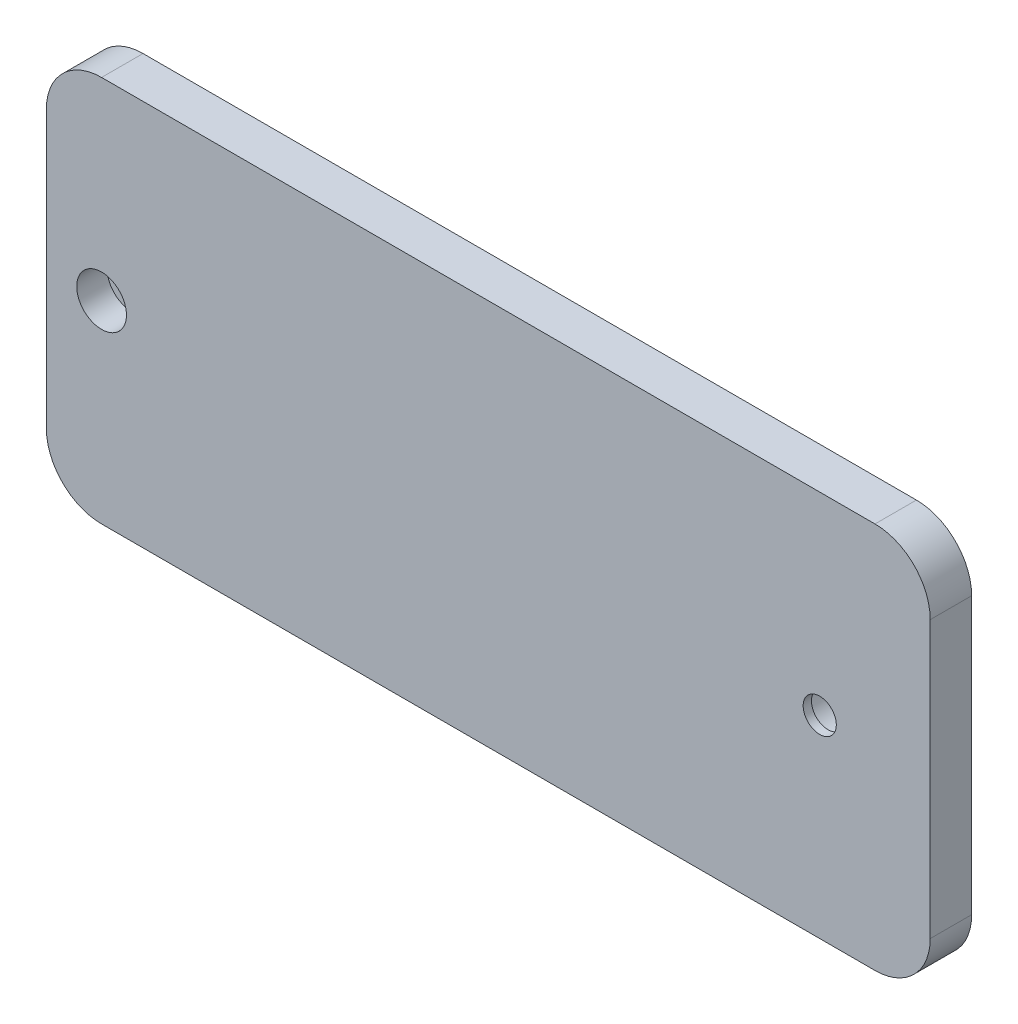
ISO-10303-21;
HEADER;
FILE_DESCRIPTION(('STEP AP214'),'2;1');
FILE_NAME('part.step','',(''),(''),'','','');
FILE_SCHEMA(('AUTOMOTIVE_DESIGN { 1 0 10303 214 1 1 1 1 }'));
ENDSEC;
DATA;
#1=APPLICATION_CONTEXT('core data for automotive mechanical design processes');
#2=APPLICATION_PROTOCOL_DEFINITION('international standard','automotive_design',2000,#1);
#3=PRODUCT_CONTEXT('',#1,'mechanical');
#4=PRODUCT('Part','Part','',(#3));
#5=PRODUCT_RELATED_PRODUCT_CATEGORY('part','',(#4));
#6=PRODUCT_DEFINITION_FORMATION('','',#4);
#7=PRODUCT_DEFINITION_CONTEXT('part definition',#1,'design');
#8=PRODUCT_DEFINITION('design','',#6,#7);
#9=PRODUCT_DEFINITION_SHAPE('','',#8);
#10=(LENGTH_UNIT() NAMED_UNIT(*) SI_UNIT(.MILLI.,.METRE.));
#11=(NAMED_UNIT(*) PLANE_ANGLE_UNIT() SI_UNIT($,.RADIAN.));
#12=(NAMED_UNIT(*) SI_UNIT($,.STERADIAN.) SOLID_ANGLE_UNIT());
#13=UNCERTAINTY_MEASURE_WITH_UNIT(LENGTH_MEASURE(1.E-05),#10,'distance_accuracy_value','');
#14=(GEOMETRIC_REPRESENTATION_CONTEXT(3) GLOBAL_UNCERTAINTY_ASSIGNED_CONTEXT((#13)) GLOBAL_UNIT_ASSIGNED_CONTEXT((#10,
#11,#12)) REPRESENTATION_CONTEXT('',''));
#15=CARTESIAN_POINT('',(0.,0.,0.));
#16=DIRECTION('',(0.,0.,1.));
#17=DIRECTION('',(1.,0.,0.));
#18=AXIS2_PLACEMENT_3D('',#15,#16,#17);
#19=CARTESIAN_POINT('',(0.,0.,0.));
#20=DIRECTION('',(0.,0.,1.));
#21=DIRECTION('',(1.,0.,0.));
#22=AXIS2_PLACEMENT_3D('',#19,#20,#21);
#23=PLANE('',#22);
#24=DIRECTION('',(0.,-1.,0.));
#25=VECTOR('',#24,1.);
#26=CARTESIAN_POINT('',(-80.,35.,0.));
#27=LINE('',#26,#25);
#28=CARTESIAN_POINT('',(-80.,25.,0.));
#29=VERTEX_POINT('',#28);
#30=CARTESIAN_POINT('',(-80.,-25.,0.));
#31=VERTEX_POINT('',#30);
#32=EDGE_CURVE('E311',#29,#31,#27,.T.);
#33=ORIENTED_EDGE('',*,*,#32,.F.);
#34=CARTESIAN_POINT('',(-70.,25.,0.));
#35=DIRECTION('',(0.,0.,1.));
#36=DIRECTION('',(1.,0.,0.));
#37=AXIS2_PLACEMENT_3D('',#34,#35,#36);
#38=CIRCLE('',#37,10.);
#39=CARTESIAN_POINT('',(-70.,35.,0.));
#40=VERTEX_POINT('',#39);
#41=EDGE_CURVE('E414',#29,#40,#38,.F.);
#42=ORIENTED_EDGE('',*,*,#41,.T.);
#43=DIRECTION('',(-1.,0.,0.));
#44=VECTOR('',#43,1.);
#45=CARTESIAN_POINT('',(-80.,35.,0.));
#46=LINE('',#45,#44);
#47=CARTESIAN_POINT('',(70.,35.,0.));
#48=VERTEX_POINT('',#47);
#49=EDGE_CURVE('E317',#48,#40,#46,.T.);
#50=ORIENTED_EDGE('',*,*,#49,.F.);
#51=CARTESIAN_POINT('',(70.,25.,0.));
#52=DIRECTION('',(0.,0.,1.));
#53=DIRECTION('',(1.,0.,0.));
#54=AXIS2_PLACEMENT_3D('',#51,#52,#53);
#55=CIRCLE('',#54,10.);
#56=CARTESIAN_POINT('',(80.,25.,0.));
#57=VERTEX_POINT('',#56);
#58=EDGE_CURVE('E405',#48,#57,#55,.F.);
#59=ORIENTED_EDGE('',*,*,#58,.T.);
#60=DIRECTION('',(0.,1.,0.));
#61=VECTOR('',#60,1.);
#62=CARTESIAN_POINT('',(80.,35.,0.));
#63=LINE('',#62,#61);
#64=CARTESIAN_POINT('',(80.,-25.,0.));
#65=VERTEX_POINT('',#64);
#66=EDGE_CURVE('E335',#65,#57,#63,.T.);
#67=ORIENTED_EDGE('',*,*,#66,.F.);
#68=CARTESIAN_POINT('',(70.,-25.,0.));
#69=DIRECTION('',(0.,0.,1.));
#70=DIRECTION('',(1.,0.,0.));
#71=AXIS2_PLACEMENT_3D('',#68,#69,#70);
#72=CIRCLE('',#71,10.);
#73=CARTESIAN_POINT('',(70.,-35.,0.));
#74=VERTEX_POINT('',#73);
#75=EDGE_CURVE('E408',#65,#74,#72,.F.);
#76=ORIENTED_EDGE('',*,*,#75,.T.);
#77=DIRECTION('',(1.,0.,0.));
#78=VECTOR('',#77,1.);
#79=CARTESIAN_POINT('',(-80.,-35.,0.));
#80=LINE('',#79,#78);
#81=CARTESIAN_POINT('',(-70.,-35.,0.));
#82=VERTEX_POINT('',#81);
#83=EDGE_CURVE('E331',#82,#74,#80,.T.);
#84=ORIENTED_EDGE('',*,*,#83,.F.);
#85=CARTESIAN_POINT('',(-70.,-25.,0.));
#86=DIRECTION('',(0.,0.,1.));
#87=DIRECTION('',(1.,0.,0.));
#88=AXIS2_PLACEMENT_3D('',#85,#86,#87);
#89=CIRCLE('',#88,10.);
#90=EDGE_CURVE('E411',#82,#31,#89,.F.);
#91=ORIENTED_EDGE('',*,*,#90,.T.);
#92=EDGE_LOOP('',(#33,#42,#50,#59,#67,#76,#84,#91));
#93=FACE_BOUND('',#92,.T.);
#94=CARTESIAN_POINT('',(-70.,0.,0.));
#95=DIRECTION('',(0.,0.,1.));
#96=DIRECTION('',(1.,0.,0.));
#97=AXIS2_PLACEMENT_3D('',#94,#95,#96);
#98=CIRCLE('',#97,2.5);
#99=CARTESIAN_POINT('',(-67.5,0.,0.));
#100=VERTEX_POINT('',#99);
#101=EDGE_CURVE('E303',#100,#100,#98,.T.);
#102=ORIENTED_EDGE('',*,*,#101,.T.);
#103=EDGE_LOOP('',(#102));
#104=FACE_BOUND('',#103,.T.);
#105=CARTESIAN_POINT('',(60.,0.,0.));
#106=DIRECTION('',(0.,0.,-1.));
#107=DIRECTION('',(-1.,0.,0.));
#108=AXIS2_PLACEMENT_3D('',#105,#106,#107);
#109=CIRCLE('',#108,5.);
#110=CARTESIAN_POINT('',(55.,0.,0.));
#111=VERTEX_POINT('',#110);
#112=EDGE_CURVE('E285',#111,#111,#109,.T.);
#113=ORIENTED_EDGE('',*,*,#112,.F.);
#114=EDGE_LOOP('',(#113));
#115=FACE_BOUND('',#114,.T.);
#116=DIRECTION('',(0.,-1.,0.));
#117=VECTOR('',#116,1.);
#118=CARTESIAN_POINT('',(35.,2.5,0.));
#119=LINE('',#118,#117);
#120=CARTESIAN_POINT('',(35.,2.5,0.));
#121=VERTEX_POINT('',#120);
#122=CARTESIAN_POINT('',(35.,-2.5,0.));
#123=VERTEX_POINT('',#122);
#124=EDGE_CURVE('E263',#121,#123,#119,.T.);
#125=ORIENTED_EDGE('',*,*,#124,.F.);
#126=DIRECTION('',(1.,0.,0.));
#127=VECTOR('',#126,1.);
#128=CARTESIAN_POINT('',(35.,2.5,0.));
#129=LINE('',#128,#127);
#130=CARTESIAN_POINT('',(-60.,2.5,0.));
#131=VERTEX_POINT('',#130);
#132=EDGE_CURVE('E246',#131,#121,#129,.T.);
#133=ORIENTED_EDGE('',*,*,#132,.F.);
#134=DIRECTION('',(0.,1.,0.));
#135=VECTOR('',#134,1.);
#136=CARTESIAN_POINT('',(-60.,2.5,0.));
#137=LINE('',#136,#135);
#138=CARTESIAN_POINT('',(-60.,-2.5,0.));
#139=VERTEX_POINT('',#138);
#140=EDGE_CURVE('E270',#139,#131,#137,.T.);
#141=ORIENTED_EDGE('',*,*,#140,.F.);
#142=DIRECTION('',(-1.,0.,0.));
#143=VECTOR('',#142,1.);
#144=CARTESIAN_POINT('',(35.,-2.5,0.));
#145=LINE('',#144,#143);
#146=EDGE_CURVE('E266',#123,#139,#145,.T.);
#147=ORIENTED_EDGE('',*,*,#146,.F.);
#148=EDGE_LOOP('',(#125,#133,#141,#147));
#149=FACE_BOUND('',#148,.T.);
#150=ADVANCED_FACE('F46',(#93,#104,#115,#149),#23,.F.);
#151=CARTESIAN_POINT('',(60.,0.,0.));
#152=DIRECTION('',(0.,0.,1.));
#153=DIRECTION('',(1.,0.,0.));
#154=AXIS2_PLACEMENT_3D('',#151,#152,#153);
#155=CYLINDRICAL_SURFACE('',#154,3.00000000000001);
#156=CARTESIAN_POINT('',(60.,0.,7.5));
#157=DIRECTION('',(0.,0.,1.));
#158=DIRECTION('',(1.,0.,0.));
#159=AXIS2_PLACEMENT_3D('',#156,#157,#158);
#160=CIRCLE('',#159,3.00000000000001);
#161=CARTESIAN_POINT('',(63.,0.,7.5));
#162=VERTEX_POINT('',#161);
#163=EDGE_CURVE('E307',#162,#162,#160,.T.);
#164=ORIENTED_EDGE('',*,*,#163,.T.);
#165=EDGE_LOOP('',(#164));
#166=FACE_BOUND('',#165,.T.);
#167=CARTESIAN_POINT('',(60.,0.,6.));
#168=DIRECTION('',(0.,0.,-1.));
#169=DIRECTION('',(-1.,0.,0.));
#170=AXIS2_PLACEMENT_3D('',#167,#168,#169);
#171=CIRCLE('',#170,3.00000000000001);
#172=CARTESIAN_POINT('',(57.,0.,6.));
#173=VERTEX_POINT('',#172);
#174=EDGE_CURVE('E290',#173,#173,#171,.F.);
#175=ORIENTED_EDGE('',*,*,#174,.F.);
#176=EDGE_LOOP('',(#175));
#177=FACE_BOUND('',#176,.T.);
#178=ADVANCED_FACE('F519',(#166,#177),#155,.F.);
#179=CARTESIAN_POINT('',(-70.,0.,0.));
#180=DIRECTION('',(0.,0.,1.));
#181=DIRECTION('',(1.,0.,0.));
#182=AXIS2_PLACEMENT_3D('',#179,#180,#181);
#183=CYLINDRICAL_SURFACE('',#182,2.5);
#184=ORIENTED_EDGE('',*,*,#101,.F.);
#185=EDGE_LOOP('',(#184));
#186=FACE_BOUND('',#185,.T.);
#187=CARTESIAN_POINT('',(-70.,0.,2.));
#188=DIRECTION('',(0.,0.,1.));
#189=DIRECTION('',(1.,0.,0.));
#190=AXIS2_PLACEMENT_3D('',#187,#188,#189);
#191=CIRCLE('',#190,2.5);
#192=CARTESIAN_POINT('',(-67.5,0.,2.));
#193=VERTEX_POINT('',#192);
#194=EDGE_CURVE('E298',#193,#193,#191,.F.);
#195=ORIENTED_EDGE('',*,*,#194,.F.);
#196=EDGE_LOOP('',(#195));
#197=FACE_BOUND('',#196,.T.);
#198=ADVANCED_FACE('F525',(#186,#197),#183,.F.);
#199=CARTESIAN_POINT('',(-80.,35.,7.5));
#200=DIRECTION('',(1.,0.,0.));
#201=DIRECTION('',(0.,0.,-1.));
#202=AXIS2_PLACEMENT_3D('',#199,#200,#201);
#203=PLANE('',#202);
#204=DIRECTION('',(0.,-1.,0.));
#205=VECTOR('',#204,1.);
#206=CARTESIAN_POINT('',(-80.,35.,7.5));
#207=LINE('',#206,#205);
#208=CARTESIAN_POINT('',(-80.,25.,7.5));
#209=VERTEX_POINT('',#208);
#210=CARTESIAN_POINT('',(-80.,-25.,7.5));
#211=VERTEX_POINT('',#210);
#212=EDGE_CURVE('E312',#209,#211,#207,.T.);
#213=ORIENTED_EDGE('',*,*,#212,.F.);
#214=DIRECTION('',(0.,0.,-1.));
#215=VECTOR('',#214,1.);
#216=CARTESIAN_POINT('',(-80.,25.,7.5));
#217=LINE('',#216,#215);
#218=EDGE_CURVE('E401',#209,#29,#217,.T.);
#219=ORIENTED_EDGE('',*,*,#218,.T.);
#220=ORIENTED_EDGE('',*,*,#32,.T.);
#221=DIRECTION('',(0.,0.,-1.));
#222=VECTOR('',#221,1.);
#223=CARTESIAN_POINT('',(-80.,-25.,7.5));
#224=LINE('',#223,#222);
#225=EDGE_CURVE('E398',#31,#211,#224,.F.);
#226=ORIENTED_EDGE('',*,*,#225,.T.);
#227=EDGE_LOOP('',(#213,#219,#220,#226));
#228=FACE_BOUND('',#227,.T.);
#229=ADVANCED_FACE('F543',(#228),#203,.F.);
#230=CARTESIAN_POINT('',(-80.,-35.,7.5));
#231=DIRECTION('',(0.,1.,0.));
#232=DIRECTION('',(-1.,0.,0.));
#233=AXIS2_PLACEMENT_3D('',#230,#231,#232);
#234=PLANE('',#233);
#235=DIRECTION('',(1.,0.,0.));
#236=VECTOR('',#235,1.);
#237=CARTESIAN_POINT('',(-80.,-35.,7.5));
#238=LINE('',#237,#236);
#239=CARTESIAN_POINT('',(-70.,-35.,7.5));
#240=VERTEX_POINT('',#239);
#241=CARTESIAN_POINT('',(70.,-35.,7.5));
#242=VERTEX_POINT('',#241);
#243=EDGE_CURVE('E316',#240,#242,#238,.T.);
#244=ORIENTED_EDGE('',*,*,#243,.F.);
#245=DIRECTION('',(0.,0.,-1.));
#246=VECTOR('',#245,1.);
#247=CARTESIAN_POINT('',(-70.,-35.,7.5));
#248=LINE('',#247,#246);
#249=EDGE_CURVE('E438',#240,#82,#248,.T.);
#250=ORIENTED_EDGE('',*,*,#249,.T.);
#251=ORIENTED_EDGE('',*,*,#83,.T.);
#252=DIRECTION('',(0.,0.,-1.));
#253=VECTOR('',#252,1.);
#254=CARTESIAN_POINT('',(70.,-35.,7.5));
#255=LINE('',#254,#253);
#256=EDGE_CURVE('E435',#74,#242,#255,.F.);
#257=ORIENTED_EDGE('',*,*,#256,.T.);
#258=EDGE_LOOP('',(#244,#250,#251,#257));
#259=FACE_BOUND('',#258,.T.);
#260=ADVANCED_FACE('F540',(#259),#234,.F.);
#261=CARTESIAN_POINT('',(80.,35.,7.5));
#262=DIRECTION('',(-1.,0.,0.));
#263=DIRECTION('',(0.,0.,1.));
#264=AXIS2_PLACEMENT_3D('',#261,#262,#263);
#265=PLANE('',#264);
#266=DIRECTION('',(0.,1.,0.));
#267=VECTOR('',#266,1.);
#268=CARTESIAN_POINT('',(80.,35.,7.5));
#269=LINE('',#268,#267);
#270=CARTESIAN_POINT('',(80.,-25.,7.5));
#271=VERTEX_POINT('',#270);
#272=CARTESIAN_POINT('',(80.,25.,7.5));
#273=VERTEX_POINT('',#272);
#274=EDGE_CURVE('E320',#271,#273,#269,.T.);
#275=ORIENTED_EDGE('',*,*,#274,.F.);
#276=DIRECTION('',(0.,0.,-1.));
#277=VECTOR('',#276,1.);
#278=CARTESIAN_POINT('',(80.,-25.,7.5));
#279=LINE('',#278,#277);
#280=EDGE_CURVE('E11',#271,#65,#279,.T.);
#281=ORIENTED_EDGE('',*,*,#280,.T.);
#282=ORIENTED_EDGE('',*,*,#66,.T.);
#283=DIRECTION('',(0.,0.,-1.));
#284=VECTOR('',#283,1.);
#285=CARTESIAN_POINT('',(80.,25.,7.5));
#286=LINE('',#285,#284);
#287=EDGE_CURVE('E55',#57,#273,#286,.F.);
#288=ORIENTED_EDGE('',*,*,#287,.T.);
#289=EDGE_LOOP('',(#275,#281,#282,#288));
#290=FACE_BOUND('',#289,.T.);
#291=ADVANCED_FACE('F536',(#290),#265,.F.);
#292=CARTESIAN_POINT('',(-80.,35.,7.5));
#293=DIRECTION('',(0.,-1.,0.));
#294=DIRECTION('',(0.,0.,-1.));
#295=AXIS2_PLACEMENT_3D('',#292,#293,#294);
#296=PLANE('',#295);
#297=ORIENTED_EDGE('',*,*,#49,.T.);
#298=DIRECTION('',(0.,0.,-1.));
#299=VECTOR('',#298,1.);
#300=CARTESIAN_POINT('',(-70.,35.,7.5));
#301=LINE('',#300,#299);
#302=CARTESIAN_POINT('',(-70.,35.,7.5));
#303=VERTEX_POINT('',#302);
#304=EDGE_CURVE('E421',#40,#303,#301,.F.);
#305=ORIENTED_EDGE('',*,*,#304,.T.);
#306=DIRECTION('',(-1.,0.,0.));
#307=VECTOR('',#306,1.);
#308=CARTESIAN_POINT('',(-80.,35.,7.5));
#309=LINE('',#308,#307);
#310=CARTESIAN_POINT('',(70.,35.,7.5));
#311=VERTEX_POINT('',#310);
#312=EDGE_CURVE('E323',#311,#303,#309,.T.);
#313=ORIENTED_EDGE('',*,*,#312,.F.);
#314=DIRECTION('',(0.,0.,-1.));
#315=VECTOR('',#314,1.);
#316=CARTESIAN_POINT('',(70.,35.,7.5));
#317=LINE('',#316,#315);
#318=EDGE_CURVE('E417',#311,#48,#317,.T.);
#319=ORIENTED_EDGE('',*,*,#318,.T.);
#320=EDGE_LOOP('',(#297,#305,#313,#319));
#321=FACE_BOUND('',#320,.T.);
#322=ADVANCED_FACE('F533',(#321),#296,.F.);
#323=CARTESIAN_POINT('',(0.,0.,7.5));
#324=DIRECTION('',(0.,0.,1.));
#325=DIRECTION('',(1.,0.,0.));
#326=AXIS2_PLACEMENT_3D('',#323,#324,#325);
#327=PLANE('',#326);
#328=CARTESIAN_POINT('',(-70.,0.,7.5));
#329=DIRECTION('',(0.,0.,1.));
#330=DIRECTION('',(1.,0.,0.));
#331=AXIS2_PLACEMENT_3D('',#328,#329,#330);
#332=CIRCLE('',#331,4.5);
#333=CARTESIAN_POINT('',(-65.5,0.,7.5));
#334=VERTEX_POINT('',#333);
#335=EDGE_CURVE('E299',#334,#334,#332,.T.);
#336=ORIENTED_EDGE('',*,*,#335,.F.);
#337=EDGE_LOOP('',(#336));
#338=FACE_BOUND('',#337,.T.);
#339=ORIENTED_EDGE('',*,*,#163,.F.);
#340=EDGE_LOOP('',(#339));
#341=FACE_BOUND('',#340,.T.);
#342=ORIENTED_EDGE('',*,*,#312,.T.);
#343=CARTESIAN_POINT('',(-70.,25.,7.5));
#344=DIRECTION('',(0.,0.,1.));
#345=DIRECTION('',(1.,0.,0.));
#346=AXIS2_PLACEMENT_3D('',#343,#344,#345);
#347=CIRCLE('',#346,10.);
#348=EDGE_CURVE('E432',#303,#209,#347,.T.);
#349=ORIENTED_EDGE('',*,*,#348,.T.);
#350=ORIENTED_EDGE('',*,*,#212,.T.);
#351=CARTESIAN_POINT('',(-70.,-25.,7.5));
#352=DIRECTION('',(0.,0.,1.));
#353=DIRECTION('',(1.,0.,0.));
#354=AXIS2_PLACEMENT_3D('',#351,#352,#353);
#355=CIRCLE('',#354,10.);
#356=EDGE_CURVE('E429',#211,#240,#355,.T.);
#357=ORIENTED_EDGE('',*,*,#356,.T.);
#358=ORIENTED_EDGE('',*,*,#243,.T.);
#359=CARTESIAN_POINT('',(70.,-25.,7.5));
#360=DIRECTION('',(0.,0.,1.));
#361=DIRECTION('',(1.,0.,0.));
#362=AXIS2_PLACEMENT_3D('',#359,#360,#361);
#363=CIRCLE('',#362,10.);
#364=EDGE_CURVE('E74',#242,#271,#363,.T.);
#365=ORIENTED_EDGE('',*,*,#364,.T.);
#366=ORIENTED_EDGE('',*,*,#274,.T.);
#367=CARTESIAN_POINT('',(70.,25.,7.5));
#368=DIRECTION('',(0.,0.,1.));
#369=DIRECTION('',(1.,0.,0.));
#370=AXIS2_PLACEMENT_3D('',#367,#368,#369);
#371=CIRCLE('',#370,10.);
#372=EDGE_CURVE('E424',#273,#311,#371,.T.);
#373=ORIENTED_EDGE('',*,*,#372,.T.);
#374=EDGE_LOOP('',(#342,#349,#350,#357,#358,#365,#366,#373));
#375=FACE_BOUND('',#374,.T.);
#376=ADVANCED_FACE('F532',(#338,#341,#375),#327,.T.);
#377=CARTESIAN_POINT('',(-70.,0.,2.));
#378=DIRECTION('',(0.,0.,1.));
#379=DIRECTION('',(1.,0.,0.));
#380=AXIS2_PLACEMENT_3D('',#377,#378,#379);
#381=PLANE('',#380);
#382=CARTESIAN_POINT('',(-70.,0.,2.));
#383=DIRECTION('',(0.,0.,1.));
#384=DIRECTION('',(1.,0.,0.));
#385=AXIS2_PLACEMENT_3D('',#382,#383,#384);
#386=CIRCLE('',#385,4.5);
#387=CARTESIAN_POINT('',(-65.5,0.,2.));
#388=VERTEX_POINT('',#387);
#389=EDGE_CURVE('E294',#388,#388,#386,.T.);
#390=ORIENTED_EDGE('',*,*,#389,.T.);
#391=EDGE_LOOP('',(#390));
#392=FACE_BOUND('',#391,.T.);
#393=ORIENTED_EDGE('',*,*,#194,.T.);
#394=EDGE_LOOP('',(#393));
#395=FACE_BOUND('',#394,.T.);
#396=ADVANCED_FACE('F587',(#392,#395),#381,.T.);
#397=CARTESIAN_POINT('',(-70.,0.,2.));
#398=DIRECTION('',(0.,0.,1.));
#399=DIRECTION('',(1.,0.,0.));
#400=AXIS2_PLACEMENT_3D('',#397,#398,#399);
#401=CYLINDRICAL_SURFACE('',#400,4.5);
#402=ORIENTED_EDGE('',*,*,#389,.F.);
#403=EDGE_LOOP('',(#402));
#404=FACE_BOUND('',#403,.T.);
#405=ORIENTED_EDGE('',*,*,#335,.T.);
#406=EDGE_LOOP('',(#405));
#407=FACE_BOUND('',#406,.T.);
#408=ADVANCED_FACE('F592',(#404,#407),#401,.F.);
#409=CARTESIAN_POINT('',(60.,0.,6.));
#410=DIRECTION('',(0.,0.,-1.));
#411=DIRECTION('',(-1.,0.,0.));
#412=AXIS2_PLACEMENT_3D('',#409,#410,#411);
#413=PLANE('',#412);
#414=CARTESIAN_POINT('',(60.,0.,6.));
#415=DIRECTION('',(0.,0.,-1.));
#416=DIRECTION('',(-1.,0.,0.));
#417=AXIS2_PLACEMENT_3D('',#414,#415,#416);
#418=CIRCLE('',#417,5.);
#419=CARTESIAN_POINT('',(55.,0.,6.));
#420=VERTEX_POINT('',#419);
#421=EDGE_CURVE('E286',#420,#420,#418,.T.);
#422=ORIENTED_EDGE('',*,*,#421,.T.);
#423=EDGE_LOOP('',(#422));
#424=FACE_BOUND('',#423,.T.);
#425=ORIENTED_EDGE('',*,*,#174,.T.);
#426=EDGE_LOOP('',(#425));
#427=FACE_BOUND('',#426,.T.);
#428=ADVANCED_FACE('F601',(#424,#427),#413,.T.);
#429=CARTESIAN_POINT('',(60.,0.,6.));
#430=DIRECTION('',(0.,0.,-1.));
#431=DIRECTION('',(-1.,0.,0.));
#432=AXIS2_PLACEMENT_3D('',#429,#430,#431);
#433=CYLINDRICAL_SURFACE('',#432,5.);
#434=ORIENTED_EDGE('',*,*,#421,.F.);
#435=EDGE_LOOP('',(#434));
#436=FACE_BOUND('',#435,.T.);
#437=ORIENTED_EDGE('',*,*,#112,.T.);
#438=EDGE_LOOP('',(#437));
#439=FACE_BOUND('',#438,.T.);
#440=ADVANCED_FACE('F516',(#436,#439),#433,.F.);
#441=CARTESIAN_POINT('',(35.,2.5,-2.3));
#442=DIRECTION('',(-1.,0.,0.));
#443=DIRECTION('',(0.,0.,1.));
#444=AXIS2_PLACEMENT_3D('',#441,#442,#443);
#445=PLANE('',#444);
#446=DIRECTION('',(0.,-1.,0.));
#447=VECTOR('',#446,1.);
#448=CARTESIAN_POINT('',(35.,6.,-2.3));
#449=LINE('',#448,#447);
#450=CARTESIAN_POINT('',(35.,-2.5,-2.3));
#451=VERTEX_POINT('',#450);
#452=CARTESIAN_POINT('',(35.,-4.94832947555214,-2.3));
#453=VERTEX_POINT('',#452);
#454=EDGE_CURVE('E238',#451,#453,#449,.T.);
#455=ORIENTED_EDGE('',*,*,#454,.T.);
#456=CARTESIAN_POINT('',(35.,-4.94832947555214,-2.8));
#457=DIRECTION('',(-1.,0.,0.));
#458=DIRECTION('',(0.,0.,1.));
#459=AXIS2_PLACEMENT_3D('',#456,#457,#458);
#460=CIRCLE('',#459,0.5);
#461=CARTESIAN_POINT('',(35.,-5.33611047740773,-3.11563569918479));
#462=VERTEX_POINT('',#461);
#463=EDGE_CURVE('E379',#453,#462,#460,.F.);
#464=ORIENTED_EDGE('',*,*,#463,.T.);
#465=DIRECTION('',(0.,0.631271398369576,-0.775562003711193));
#466=VECTOR('',#465,1.);
#467=CARTESIAN_POINT('',(35.,-2.5,-6.6));
#468=LINE('',#467,#466);
#469=CARTESIAN_POINT('',(35.,-2.80012793155965,-6.23127139836958));
#470=VERTEX_POINT('',#469);
#471=EDGE_CURVE('E460',#462,#470,#468,.T.);
#472=ORIENTED_EDGE('',*,*,#471,.T.);
#473=CARTESIAN_POINT('',(35.,-2.02456592784845,-5.6));
#474=DIRECTION('',(-1.,0.,0.));
#475=DIRECTION('',(0.,0.,1.));
#476=AXIS2_PLACEMENT_3D('',#473,#474,#475);
#477=CIRCLE('',#476,1.);
#478=CARTESIAN_POINT('',(35.,-2.02456592784845,-6.6));
#479=VERTEX_POINT('',#478);
#480=EDGE_CURVE('E353',#470,#479,#477,.F.);
#481=ORIENTED_EDGE('',*,*,#480,.T.);
#482=DIRECTION('',(0.,1.,0.));
#483=VECTOR('',#482,1.);
#484=CARTESIAN_POINT('',(35.,2.5,-6.6));
#485=LINE('',#484,#483);
#486=CARTESIAN_POINT('',(35.,2.02456592784845,-6.6));
#487=VERTEX_POINT('',#486);
#488=EDGE_CURVE('E463',#479,#487,#485,.T.);
#489=ORIENTED_EDGE('',*,*,#488,.T.);
#490=CARTESIAN_POINT('',(35.,2.02456592784845,-5.6));
#491=DIRECTION('',(-1.,0.,0.));
#492=DIRECTION('',(0.,0.,1.));
#493=AXIS2_PLACEMENT_3D('',#490,#491,#492);
#494=CIRCLE('',#493,1.);
#495=CARTESIAN_POINT('',(35.,2.80012793155965,-6.23127139836958));
#496=VERTEX_POINT('',#495);
#497=EDGE_CURVE('E350',#487,#496,#494,.F.);
#498=ORIENTED_EDGE('',*,*,#497,.T.);
#499=DIRECTION('',(0.,0.631271398369576,0.775562003711193));
#500=VECTOR('',#499,1.);
#501=CARTESIAN_POINT('',(35.,6.,-2.3));
#502=LINE('',#501,#500);
#503=CARTESIAN_POINT('',(35.,5.33611047740773,-3.11563569918479));
#504=VERTEX_POINT('',#503);
#505=EDGE_CURVE('E467',#496,#504,#502,.T.);
#506=ORIENTED_EDGE('',*,*,#505,.T.);
#507=CARTESIAN_POINT('',(35.,4.94832947555213,-2.8));
#508=DIRECTION('',(-1.,0.,0.));
#509=DIRECTION('',(0.,0.,1.));
#510=AXIS2_PLACEMENT_3D('',#507,#508,#509);
#511=CIRCLE('',#510,0.5);
#512=CARTESIAN_POINT('',(35.,4.94832947555213,-2.3));
#513=VERTEX_POINT('',#512);
#514=EDGE_CURVE('E232',#504,#513,#511,.F.);
#515=ORIENTED_EDGE('',*,*,#514,.T.);
#516=CARTESIAN_POINT('',(35.,2.5,-2.3));
#517=VERTEX_POINT('',#516);
#518=EDGE_CURVE('E225',#513,#517,#449,.T.);
#519=ORIENTED_EDGE('',*,*,#518,.T.);
#520=DIRECTION('',(0.,0.,1.));
#521=VECTOR('',#520,1.);
#522=CARTESIAN_POINT('',(35.,2.5,-2.3));
#523=LINE('',#522,#521);
#524=EDGE_CURVE('E230',#517,#121,#523,.T.);
#525=ORIENTED_EDGE('',*,*,#524,.T.);
#526=ORIENTED_EDGE('',*,*,#124,.T.);
#527=DIRECTION('',(0.,0.,1.));
#528=VECTOR('',#527,1.);
#529=CARTESIAN_POINT('',(35.,-2.5,-2.3));
#530=LINE('',#529,#528);
#531=EDGE_CURVE('E281',#451,#123,#530,.T.);
#532=ORIENTED_EDGE('',*,*,#531,.F.);
#533=EDGE_LOOP('',(#455,#464,#472,#481,#489,#498,#506,#515,#519,#525,#526,#532));
#534=FACE_BOUND('',#533,.T.);
#535=ADVANCED_FACE('F228',(#534),#445,.F.);
#536=CARTESIAN_POINT('',(35.,-2.5,-2.3));
#537=DIRECTION('',(0.,1.,0.));
#538=DIRECTION('',(0.,0.,1.));
#539=AXIS2_PLACEMENT_3D('',#536,#537,#538);
#540=PLANE('',#539);
#541=ORIENTED_EDGE('',*,*,#146,.T.);
#542=DIRECTION('',(0.,0.,1.));
#543=VECTOR('',#542,1.);
#544=CARTESIAN_POINT('',(-60.,-2.5,-2.3));
#545=LINE('',#544,#543);
#546=CARTESIAN_POINT('',(-60.,-2.5,-2.3));
#547=VERTEX_POINT('',#546);
#548=EDGE_CURVE('E277',#547,#139,#545,.T.);
#549=ORIENTED_EDGE('',*,*,#548,.F.);
#550=DIRECTION('',(-1.,0.,0.));
#551=VECTOR('',#550,1.);
#552=CARTESIAN_POINT('',(35.,-2.5,-2.3));
#553=LINE('',#552,#551);
#554=EDGE_CURVE('E255',#451,#547,#553,.T.);
#555=ORIENTED_EDGE('',*,*,#554,.F.);
#556=ORIENTED_EDGE('',*,*,#531,.T.);
#557=EDGE_LOOP('',(#541,#549,#555,#556));
#558=FACE_BOUND('',#557,.T.);
#559=ADVANCED_FACE('F508',(#558),#540,.F.);
#560=CARTESIAN_POINT('',(-60.,2.5,-2.3));
#561=DIRECTION('',(1.,0.,0.));
#562=DIRECTION('',(0.,0.,-1.));
#563=AXIS2_PLACEMENT_3D('',#560,#561,#562);
#564=PLANE('',#563);
#565=DIRECTION('',(0.,0.631271398369576,-0.775562003711193));
#566=VECTOR('',#565,1.);
#567=CARTESIAN_POINT('',(-60.,-2.5,-6.6));
#568=LINE('',#567,#566);
#569=CARTESIAN_POINT('',(-60.,-5.33611047740773,-3.11563569918479));
#570=VERTEX_POINT('',#569);
#571=CARTESIAN_POINT('',(-60.,-2.80012793155965,-6.23127139836958));
#572=VERTEX_POINT('',#571);
#573=EDGE_CURVE('E237',#570,#572,#568,.T.);
#574=ORIENTED_EDGE('',*,*,#573,.F.);
#575=CARTESIAN_POINT('',(-60.,-4.94832947555214,-2.8));
#576=DIRECTION('',(1.,0.,0.));
#577=DIRECTION('',(0.,0.,-1.));
#578=AXIS2_PLACEMENT_3D('',#575,#576,#577);
#579=CIRCLE('',#578,0.5);
#580=CARTESIAN_POINT('',(-60.,-4.94832947555214,-2.3));
#581=VERTEX_POINT('',#580);
#582=EDGE_CURVE('E388',#570,#581,#579,.F.);
#583=ORIENTED_EDGE('',*,*,#582,.T.);
#584=DIRECTION('',(0.,-1.,0.));
#585=VECTOR('',#584,1.);
#586=CARTESIAN_POINT('',(-60.,6.,-2.3));
#587=LINE('',#586,#585);
#588=EDGE_CURVE('E442',#547,#581,#587,.T.);
#589=ORIENTED_EDGE('',*,*,#588,.F.);
#590=ORIENTED_EDGE('',*,*,#548,.T.);
#591=ORIENTED_EDGE('',*,*,#140,.T.);
#592=DIRECTION('',(0.,0.,1.));
#593=VECTOR('',#592,1.);
#594=CARTESIAN_POINT('',(-60.,2.5,-2.3));
#595=LINE('',#594,#593);
#596=CARTESIAN_POINT('',(-60.,2.5,-2.3));
#597=VERTEX_POINT('',#596);
#598=EDGE_CURVE('E248',#597,#131,#595,.T.);
#599=ORIENTED_EDGE('',*,*,#598,.F.);
#600=CARTESIAN_POINT('',(-60.,4.94832947555213,-2.3));
#601=VERTEX_POINT('',#600);
#602=EDGE_CURVE('E252',#601,#597,#587,.T.);
#603=ORIENTED_EDGE('',*,*,#602,.F.);
#604=CARTESIAN_POINT('',(-60.,4.94832947555213,-2.8));
#605=DIRECTION('',(1.,0.,0.));
#606=DIRECTION('',(0.,0.,-1.));
#607=AXIS2_PLACEMENT_3D('',#604,#605,#606);
#608=CIRCLE('',#607,0.5);
#609=CARTESIAN_POINT('',(-60.,5.33611047740773,-3.11563569918479));
#610=VERTEX_POINT('',#609);
#611=EDGE_CURVE('E385',#601,#610,#608,.F.);
#612=ORIENTED_EDGE('',*,*,#611,.T.);
#613=DIRECTION('',(0.,0.631271398369576,0.775562003711193));
#614=VECTOR('',#613,1.);
#615=CARTESIAN_POINT('',(-60.,6.,-2.3));
#616=LINE('',#615,#614);
#617=CARTESIAN_POINT('',(-60.,2.80012793155965,-6.23127139836958));
#618=VERTEX_POINT('',#617);
#619=EDGE_CURVE('E444',#618,#610,#616,.T.);
#620=ORIENTED_EDGE('',*,*,#619,.F.);
#621=CARTESIAN_POINT('',(-60.,2.02456592784845,-5.6));
#622=DIRECTION('',(1.,0.,0.));
#623=DIRECTION('',(0.,0.,-1.));
#624=AXIS2_PLACEMENT_3D('',#621,#622,#623);
#625=CIRCLE('',#624,1.);
#626=CARTESIAN_POINT('',(-60.,2.02456592784845,-6.6));
#627=VERTEX_POINT('',#626);
#628=EDGE_CURVE('E363',#618,#627,#625,.F.);
#629=ORIENTED_EDGE('',*,*,#628,.T.);
#630=DIRECTION('',(0.,1.,0.));
#631=VECTOR('',#630,1.);
#632=CARTESIAN_POINT('',(-60.,2.5,-6.6));
#633=LINE('',#632,#631);
#634=CARTESIAN_POINT('',(-60.,-2.02456592784845,-6.6));
#635=VERTEX_POINT('',#634);
#636=EDGE_CURVE('E447',#635,#627,#633,.T.);
#637=ORIENTED_EDGE('',*,*,#636,.F.);
#638=CARTESIAN_POINT('',(-60.,-2.02456592784845,-5.6));
#639=DIRECTION('',(1.,0.,0.));
#640=DIRECTION('',(0.,0.,-1.));
#641=AXIS2_PLACEMENT_3D('',#638,#639,#640);
#642=CIRCLE('',#641,1.);
#643=EDGE_CURVE('E366',#635,#572,#642,.F.);
#644=ORIENTED_EDGE('',*,*,#643,.T.);
#645=EDGE_LOOP('',(#574,#583,#589,#590,#591,#599,#603,#612,#620,#629,#637,#644));
#646=FACE_BOUND('',#645,.T.);
#647=ADVANCED_FACE('F486',(#646),#564,.F.);
#648=CARTESIAN_POINT('',(35.,2.5,-2.3));
#649=DIRECTION('',(0.,-1.,0.));
#650=DIRECTION('',(0.,0.,-1.));
#651=AXIS2_PLACEMENT_3D('',#648,#649,#650);
#652=PLANE('',#651);
#653=ORIENTED_EDGE('',*,*,#132,.T.);
#654=ORIENTED_EDGE('',*,*,#524,.F.);
#655=DIRECTION('',(1.,0.,0.));
#656=VECTOR('',#655,1.);
#657=CARTESIAN_POINT('',(35.,2.5,-2.3));
#658=LINE('',#657,#656);
#659=EDGE_CURVE('E245',#597,#517,#658,.T.);
#660=ORIENTED_EDGE('',*,*,#659,.F.);
#661=ORIENTED_EDGE('',*,*,#598,.T.);
#662=EDGE_LOOP('',(#653,#654,#660,#661));
#663=FACE_BOUND('',#662,.T.);
#664=ADVANCED_FACE('F243',(#663),#652,.F.);
#665=CARTESIAN_POINT('',(-60.,6.,-2.3));
#666=DIRECTION('',(0.,0.,1.));
#667=DIRECTION('',(1.,0.,0.));
#668=AXIS2_PLACEMENT_3D('',#665,#666,#667);
#669=PLANE('',#668);
#670=ORIENTED_EDGE('',*,*,#588,.T.);
#671=DIRECTION('',(1.,0.,0.));
#672=VECTOR('',#671,1.);
#673=CARTESIAN_POINT('',(-60.,-4.94832947555214,-2.3));
#674=LINE('',#673,#672);
#675=EDGE_CURVE('E373',#581,#453,#674,.T.);
#676=ORIENTED_EDGE('',*,*,#675,.T.);
#677=ORIENTED_EDGE('',*,*,#454,.F.);
#678=ORIENTED_EDGE('',*,*,#554,.T.);
#679=EDGE_LOOP('',(#670,#676,#677,#678));
#680=FACE_BOUND('',#679,.T.);
#681=ADVANCED_FACE('F475',(#680),#669,.T.);
#682=CARTESIAN_POINT('',(-60.,-2.5,-6.6));
#683=DIRECTION('',(0.,-0.775562003711193,-0.631271398369576));
#684=DIRECTION('',(0.,0.631271398369576,-0.775562003711193));
#685=AXIS2_PLACEMENT_3D('',#682,#683,#684);
#686=PLANE('',#685);
#687=ORIENTED_EDGE('',*,*,#471,.F.);
#688=DIRECTION('',(1.,0.,0.));
#689=VECTOR('',#688,1.);
#690=CARTESIAN_POINT('',(-60.,-5.33611047740773,-3.11563569918479));
#691=LINE('',#690,#689);
#692=EDGE_CURVE('E382',#462,#570,#691,.F.);
#693=ORIENTED_EDGE('',*,*,#692,.T.);
#694=ORIENTED_EDGE('',*,*,#573,.T.);
#695=DIRECTION('',(1.,0.,0.));
#696=VECTOR('',#695,1.);
#697=CARTESIAN_POINT('',(-60.,-2.80012793155965,-6.23127139836958));
#698=LINE('',#697,#696);
#699=EDGE_CURVE('E327',#572,#470,#698,.T.);
#700=ORIENTED_EDGE('',*,*,#699,.T.);
#701=EDGE_LOOP('',(#687,#693,#694,#700));
#702=FACE_BOUND('',#701,.T.);
#703=ADVANCED_FACE('F484',(#702),#686,.T.);
#704=ORIENTED_EDGE('',*,*,#518,.F.);
#705=DIRECTION('',(1.,0.,0.));
#706=VECTOR('',#705,1.);
#707=CARTESIAN_POINT('',(-60.,4.94832947555213,-2.3));
#708=LINE('',#707,#706);
#709=EDGE_CURVE('E395',#513,#601,#708,.F.);
#710=ORIENTED_EDGE('',*,*,#709,.T.);
#711=ORIENTED_EDGE('',*,*,#602,.T.);
#712=ORIENTED_EDGE('',*,*,#659,.T.);
#713=EDGE_LOOP('',(#704,#710,#711,#712));
#714=FACE_BOUND('',#713,.T.);
#715=ADVANCED_FACE('F250',(#714),#669,.T.);
#716=CARTESIAN_POINT('',(-60.,6.,-2.3));
#717=DIRECTION('',(0.,0.775562003711193,-0.631271398369576));
#718=DIRECTION('',(0.,0.631271398369576,0.775562003711193));
#719=AXIS2_PLACEMENT_3D('',#716,#717,#718);
#720=PLANE('',#719);
#721=ORIENTED_EDGE('',*,*,#619,.T.);
#722=DIRECTION('',(1.,0.,0.));
#723=VECTOR('',#722,1.);
#724=CARTESIAN_POINT('',(-60.,5.33611047740773,-3.11563569918479));
#725=LINE('',#724,#723);
#726=EDGE_CURVE('E391',#610,#504,#725,.T.);
#727=ORIENTED_EDGE('',*,*,#726,.T.);
#728=ORIENTED_EDGE('',*,*,#505,.F.);
#729=DIRECTION('',(1.,0.,0.));
#730=VECTOR('',#729,1.);
#731=CARTESIAN_POINT('',(-60.,2.80012793155965,-6.23127139836958));
#732=LINE('',#731,#730);
#733=EDGE_CURVE('E370',#496,#618,#732,.F.);
#734=ORIENTED_EDGE('',*,*,#733,.T.);
#735=EDGE_LOOP('',(#721,#727,#728,#734));
#736=FACE_BOUND('',#735,.T.);
#737=ADVANCED_FACE('F502',(#736),#720,.T.);
#738=CARTESIAN_POINT('',(-60.,2.5,-6.6));
#739=DIRECTION('',(0.,0.,-1.));
#740=DIRECTION('',(-1.,0.,0.));
#741=AXIS2_PLACEMENT_3D('',#738,#739,#740);
#742=PLANE('',#741);
#743=ORIENTED_EDGE('',*,*,#488,.F.);
#744=DIRECTION('',(1.,0.,0.));
#745=VECTOR('',#744,1.);
#746=CARTESIAN_POINT('',(-60.,-2.02456592784845,-6.6));
#747=LINE('',#746,#745);
#748=EDGE_CURVE('E360',#479,#635,#747,.F.);
#749=ORIENTED_EDGE('',*,*,#748,.T.);
#750=ORIENTED_EDGE('',*,*,#636,.T.);
#751=DIRECTION('',(1.,0.,0.));
#752=VECTOR('',#751,1.);
#753=CARTESIAN_POINT('',(-60.,2.02456592784845,-6.6));
#754=LINE('',#753,#752);
#755=EDGE_CURVE('E356',#627,#487,#754,.T.);
#756=ORIENTED_EDGE('',*,*,#755,.T.);
#757=EDGE_LOOP('',(#743,#749,#750,#756));
#758=FACE_BOUND('',#757,.T.);
#759=ADVANCED_FACE('F496',(#758),#742,.T.);
#760=CARTESIAN_POINT('',(-60.,-2.02456592784845,-5.6));
#761=DIRECTION('',(1.,0.,0.));
#762=DIRECTION('',(0.,0.,-1.));
#763=AXIS2_PLACEMENT_3D('',#760,#761,#762);
#764=CYLINDRICAL_SURFACE('',#763,1.);
#765=ORIENTED_EDGE('',*,*,#643,.F.);
#766=ORIENTED_EDGE('',*,*,#748,.F.);
#767=ORIENTED_EDGE('',*,*,#480,.F.);
#768=ORIENTED_EDGE('',*,*,#699,.F.);
#769=EDGE_LOOP('',(#765,#766,#767,#768));
#770=FACE_BOUND('',#769,.T.);
#771=ADVANCED_FACE('F493',(#770),#764,.T.);
#772=CARTESIAN_POINT('',(-60.,2.02456592784845,-5.6));
#773=DIRECTION('',(1.,0.,0.));
#774=DIRECTION('',(0.,0.,-1.));
#775=AXIS2_PLACEMENT_3D('',#772,#773,#774);
#776=CYLINDRICAL_SURFACE('',#775,1.);
#777=ORIENTED_EDGE('',*,*,#628,.F.);
#778=ORIENTED_EDGE('',*,*,#733,.F.);
#779=ORIENTED_EDGE('',*,*,#497,.F.);
#780=ORIENTED_EDGE('',*,*,#755,.F.);
#781=EDGE_LOOP('',(#777,#778,#779,#780));
#782=FACE_BOUND('',#781,.T.);
#783=ADVANCED_FACE('F500',(#782),#776,.T.);
#784=CARTESIAN_POINT('',(-60.,-4.94832947555214,-2.8));
#785=DIRECTION('',(1.,0.,0.));
#786=DIRECTION('',(0.,0.,-1.));
#787=AXIS2_PLACEMENT_3D('',#784,#785,#786);
#788=CYLINDRICAL_SURFACE('',#787,0.5);
#789=ORIENTED_EDGE('',*,*,#582,.F.);
#790=ORIENTED_EDGE('',*,*,#692,.F.);
#791=ORIENTED_EDGE('',*,*,#463,.F.);
#792=ORIENTED_EDGE('',*,*,#675,.F.);
#793=EDGE_LOOP('',(#789,#790,#791,#792));
#794=FACE_BOUND('',#793,.T.);
#795=ADVANCED_FACE('F480',(#794),#788,.T.);
#796=CARTESIAN_POINT('',(-60.,4.94832947555213,-2.8));
#797=DIRECTION('',(1.,0.,0.));
#798=DIRECTION('',(0.,0.,-1.));
#799=AXIS2_PLACEMENT_3D('',#796,#797,#798);
#800=CYLINDRICAL_SURFACE('',#799,0.5);
#801=ORIENTED_EDGE('',*,*,#611,.F.);
#802=ORIENTED_EDGE('',*,*,#709,.F.);
#803=ORIENTED_EDGE('',*,*,#514,.F.);
#804=ORIENTED_EDGE('',*,*,#726,.F.);
#805=EDGE_LOOP('',(#801,#802,#803,#804));
#806=FACE_BOUND('',#805,.T.);
#807=ADVANCED_FACE('F505',(#806),#800,.T.);
#808=CARTESIAN_POINT('',(-70.,25.,7.5));
#809=DIRECTION('',(0.,0.,-1.));
#810=DIRECTION('',(-1.,0.,0.));
#811=AXIS2_PLACEMENT_3D('',#808,#809,#810);
#812=CYLINDRICAL_SURFACE('',#811,10.);
#813=ORIENTED_EDGE('',*,*,#348,.F.);
#814=ORIENTED_EDGE('',*,*,#304,.F.);
#815=ORIENTED_EDGE('',*,*,#41,.F.);
#816=ORIENTED_EDGE('',*,*,#218,.F.);
#817=EDGE_LOOP('',(#813,#814,#815,#816));
#818=FACE_BOUND('',#817,.T.);
#819=ADVANCED_FACE('F556',(#818),#812,.T.);
#820=CARTESIAN_POINT('',(-70.,-25.,7.5));
#821=DIRECTION('',(0.,0.,-1.));
#822=DIRECTION('',(-1.,0.,0.));
#823=AXIS2_PLACEMENT_3D('',#820,#821,#822);
#824=CYLINDRICAL_SURFACE('',#823,10.);
#825=ORIENTED_EDGE('',*,*,#356,.F.);
#826=ORIENTED_EDGE('',*,*,#225,.F.);
#827=ORIENTED_EDGE('',*,*,#90,.F.);
#828=ORIENTED_EDGE('',*,*,#249,.F.);
#829=EDGE_LOOP('',(#825,#826,#827,#828));
#830=FACE_BOUND('',#829,.T.);
#831=ADVANCED_FACE('F559',(#830),#824,.T.);
#832=CARTESIAN_POINT('',(70.,-25.,7.5));
#833=DIRECTION('',(0.,0.,-1.));
#834=DIRECTION('',(-1.,0.,0.));
#835=AXIS2_PLACEMENT_3D('',#832,#833,#834);
#836=CYLINDRICAL_SURFACE('',#835,10.);
#837=ORIENTED_EDGE('',*,*,#364,.F.);
#838=ORIENTED_EDGE('',*,*,#256,.F.);
#839=ORIENTED_EDGE('',*,*,#75,.F.);
#840=ORIENTED_EDGE('',*,*,#280,.F.);
#841=EDGE_LOOP('',(#837,#838,#839,#840));
#842=FACE_BOUND('',#841,.T.);
#843=ADVANCED_FACE('F562',(#842),#836,.T.);
#844=CARTESIAN_POINT('',(70.,25.,7.5));
#845=DIRECTION('',(0.,0.,-1.));
#846=DIRECTION('',(-1.,0.,0.));
#847=AXIS2_PLACEMENT_3D('',#844,#845,#846);
#848=CYLINDRICAL_SURFACE('',#847,10.);
#849=ORIENTED_EDGE('',*,*,#372,.F.);
#850=ORIENTED_EDGE('',*,*,#287,.F.);
#851=ORIENTED_EDGE('',*,*,#58,.F.);
#852=ORIENTED_EDGE('',*,*,#318,.F.);
#853=EDGE_LOOP('',(#849,#850,#851,#852));
#854=FACE_BOUND('',#853,.T.);
#855=ADVANCED_FACE('F48',(#854),#848,.T.);
#856=CLOSED_SHELL('',(#150,#178,#198,#229,#260,#291,#322,#376,#396,#408,#428,#440,#535,#559,
#647,#664,#681,#703,#715,#737,#759,#771,#783,#795,#807,#819,#831,#843,#855));
#857=MANIFOLD_SOLID_BREP('B2',#856);
#858=ADVANCED_BREP_SHAPE_REPRESENTATION('',(#18,#857),#14);
#859=SHAPE_DEFINITION_REPRESENTATION(#9,#858);
ENDSEC;
END-ISO-10303-21;
